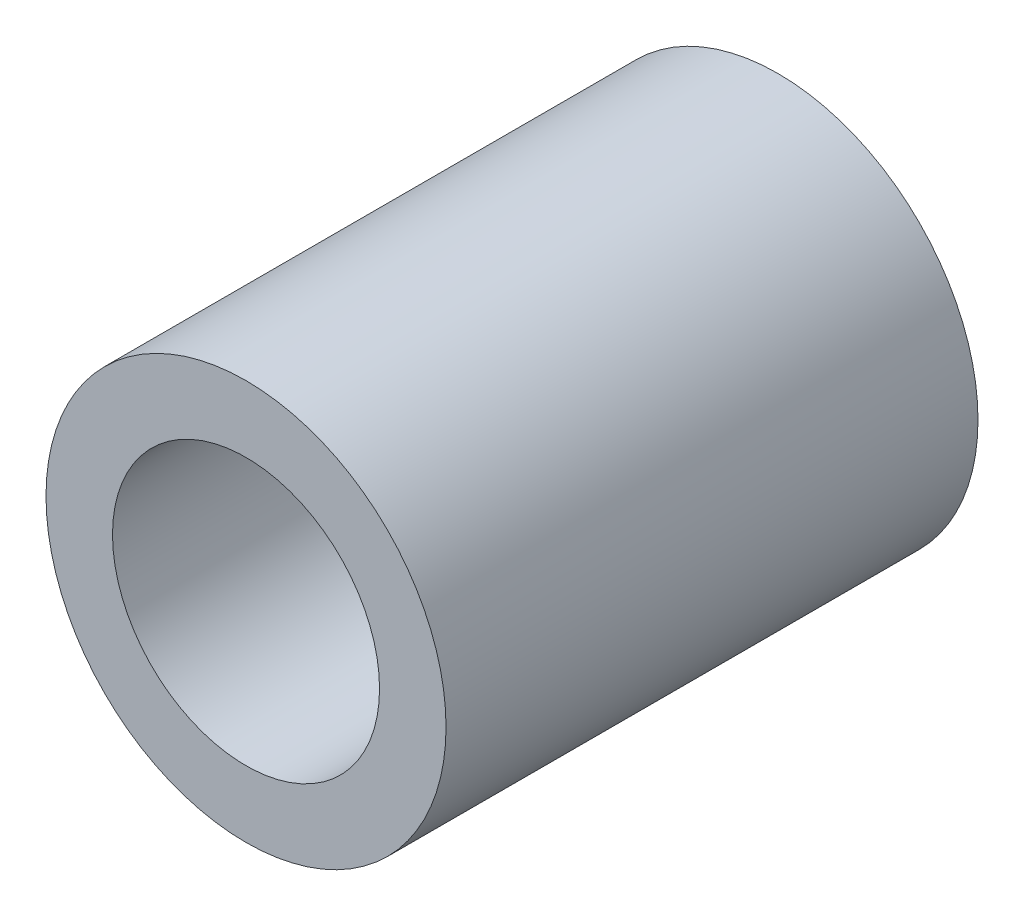
ISO-10303-21;
HEADER;
FILE_DESCRIPTION(('STEP AP214'),'2;1');
FILE_NAME('part.step','',(''),(''),'','','');
FILE_SCHEMA(('AUTOMOTIVE_DESIGN { 1 0 10303 214 1 1 1 1 }'));
ENDSEC;
DATA;
#1=APPLICATION_CONTEXT('core data for automotive mechanical design processes');
#2=APPLICATION_PROTOCOL_DEFINITION('international standard','automotive_design',2000,#1);
#3=PRODUCT_CONTEXT('',#1,'mechanical');
#4=PRODUCT('Part','Part','',(#3));
#5=PRODUCT_RELATED_PRODUCT_CATEGORY('part','',(#4));
#6=PRODUCT_DEFINITION_FORMATION('','',#4);
#7=PRODUCT_DEFINITION_CONTEXT('part definition',#1,'design');
#8=PRODUCT_DEFINITION('design','',#6,#7);
#9=PRODUCT_DEFINITION_SHAPE('','',#8);
#10=(LENGTH_UNIT() NAMED_UNIT(*) SI_UNIT(.MILLI.,.METRE.));
#11=(NAMED_UNIT(*) PLANE_ANGLE_UNIT() SI_UNIT($,.RADIAN.));
#12=(NAMED_UNIT(*) SI_UNIT($,.STERADIAN.) SOLID_ANGLE_UNIT());
#13=UNCERTAINTY_MEASURE_WITH_UNIT(LENGTH_MEASURE(1.E-05),#10,'distance_accuracy_value','');
#14=(GEOMETRIC_REPRESENTATION_CONTEXT(3) GLOBAL_UNCERTAINTY_ASSIGNED_CONTEXT((#13)) GLOBAL_UNIT_ASSIGNED_CONTEXT((#10,
#11,#12)) REPRESENTATION_CONTEXT('',''));
#15=CARTESIAN_POINT('',(0.,0.,0.));
#16=DIRECTION('',(0.,0.,1.));
#17=DIRECTION('',(1.,0.,0.));
#18=AXIS2_PLACEMENT_3D('',#15,#16,#17);
#19=CARTESIAN_POINT('',(0.,0.,6.35));
#20=DIRECTION('',(0.,0.,1.));
#21=DIRECTION('',(1.,0.,0.));
#22=AXIS2_PLACEMENT_3D('',#19,#20,#21);
#23=PLANE('',#22);
#24=CARTESIAN_POINT('',(0.,0.,6.35));
#25=DIRECTION('',(0.,0.,1.));
#26=DIRECTION('',(1.,0.,0.));
#27=AXIS2_PLACEMENT_3D('',#24,#25,#26);
#28=CIRCLE('',#27,4.7752);
#29=CARTESIAN_POINT('',(4.7752,0.,6.35));
#30=VERTEX_POINT('',#29);
#31=EDGE_CURVE('E10',#30,#30,#28,.T.);
#32=ORIENTED_EDGE('',*,*,#31,.T.);
#33=EDGE_LOOP('',(#32));
#34=FACE_BOUND('',#33,.T.);
#35=CARTESIAN_POINT('',(0.,0.,6.35));
#36=DIRECTION('',(0.,0.,1.));
#37=DIRECTION('',(1.,0.,0.));
#38=AXIS2_PLACEMENT_3D('',#35,#36,#37);
#39=CIRCLE('',#38,3.1877);
#40=CARTESIAN_POINT('',(3.1877,0.,6.35));
#41=VERTEX_POINT('',#40);
#42=EDGE_CURVE('E42',#41,#41,#39,.T.);
#43=ORIENTED_EDGE('',*,*,#42,.F.);
#44=EDGE_LOOP('',(#43));
#45=FACE_BOUND('',#44,.T.);
#46=ADVANCED_FACE('F31',(#34,#45),#23,.T.);
#47=CARTESIAN_POINT('',(0.,0.,-6.35));
#48=DIRECTION('',(0.,0.,1.));
#49=DIRECTION('',(1.,0.,0.));
#50=AXIS2_PLACEMENT_3D('',#47,#48,#49);
#51=PLANE('',#50);
#52=CARTESIAN_POINT('',(0.,0.,-6.35));
#53=DIRECTION('',(0.,0.,1.));
#54=DIRECTION('',(1.,0.,0.));
#55=AXIS2_PLACEMENT_3D('',#52,#53,#54);
#56=CIRCLE('',#55,4.7752);
#57=CARTESIAN_POINT('',(4.7752,0.,-6.35));
#58=VERTEX_POINT('',#57);
#59=EDGE_CURVE('E35',#58,#58,#56,.T.);
#60=ORIENTED_EDGE('',*,*,#59,.F.);
#61=EDGE_LOOP('',(#60));
#62=FACE_BOUND('',#61,.T.);
#63=CARTESIAN_POINT('',(0.,0.,-6.35));
#64=DIRECTION('',(0.,0.,1.));
#65=DIRECTION('',(1.,0.,0.));
#66=AXIS2_PLACEMENT_3D('',#63,#64,#65);
#67=CIRCLE('',#66,3.1877);
#68=CARTESIAN_POINT('',(3.1877,0.,-6.35));
#69=VERTEX_POINT('',#68);
#70=EDGE_CURVE('E44',#69,#69,#67,.T.);
#71=ORIENTED_EDGE('',*,*,#70,.T.);
#72=EDGE_LOOP('',(#71));
#73=FACE_BOUND('',#72,.T.);
#74=ADVANCED_FACE('F54',(#62,#73),#51,.F.);
#75=CARTESIAN_POINT('',(0.,0.,6.35));
#76=DIRECTION('',(0.,0.,-1.));
#77=DIRECTION('',(-1.,0.,0.));
#78=AXIS2_PLACEMENT_3D('',#75,#76,#77);
#79=CYLINDRICAL_SURFACE('',#78,4.7752);
#80=ORIENTED_EDGE('',*,*,#31,.F.);
#81=EDGE_LOOP('',(#80));
#82=FACE_BOUND('',#81,.T.);
#83=ORIENTED_EDGE('',*,*,#59,.T.);
#84=EDGE_LOOP('',(#83));
#85=FACE_BOUND('',#84,.T.);
#86=ADVANCED_FACE('F33',(#82,#85),#79,.T.);
#87=CARTESIAN_POINT('',(0.,0.,6.35));
#88=DIRECTION('',(0.,0.,-1.));
#89=DIRECTION('',(-1.,0.,0.));
#90=AXIS2_PLACEMENT_3D('',#87,#88,#89);
#91=CYLINDRICAL_SURFACE('',#90,3.1877);
#92=ORIENTED_EDGE('',*,*,#42,.T.);
#93=EDGE_LOOP('',(#92));
#94=FACE_BOUND('',#93,.T.);
#95=ORIENTED_EDGE('',*,*,#70,.F.);
#96=EDGE_LOOP('',(#95));
#97=FACE_BOUND('',#96,.T.);
#98=ADVANCED_FACE('F50',(#94,#97),#91,.F.);
#99=CLOSED_SHELL('',(#46,#74,#86,#98));
#100=MANIFOLD_SOLID_BREP('B2',#99);
#101=ADVANCED_BREP_SHAPE_REPRESENTATION('',(#18,#100),#14);
#102=SHAPE_DEFINITION_REPRESENTATION(#9,#101);
ENDSEC;
END-ISO-10303-21;
